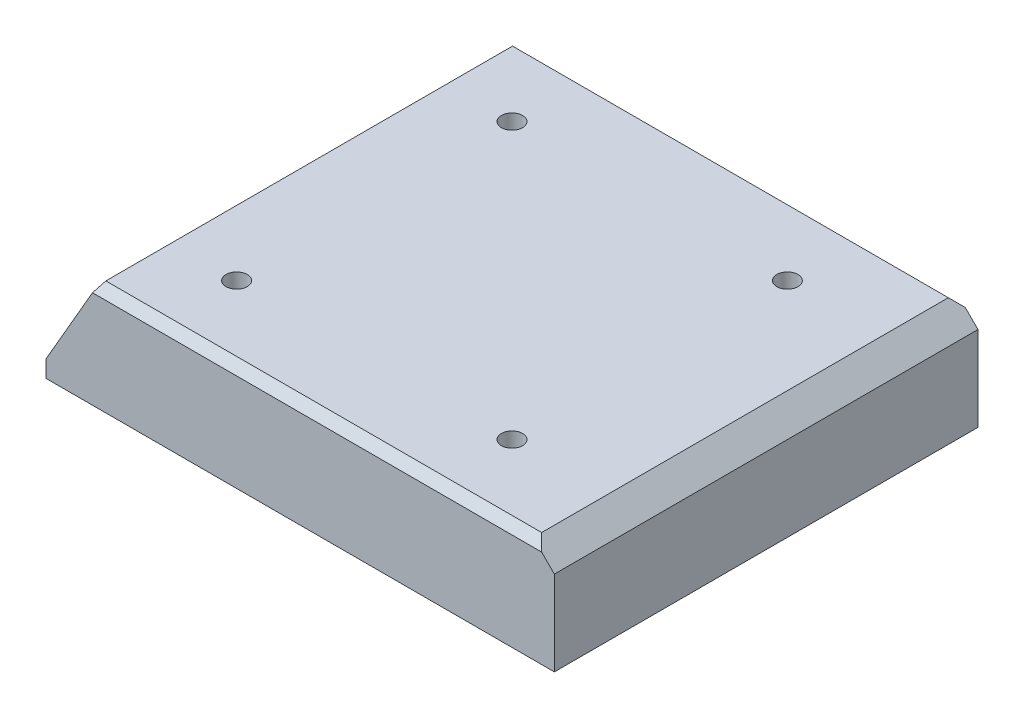
ISO-10303-21;
HEADER;
FILE_DESCRIPTION(('STEP AP214'),'2;1');
FILE_NAME('part.step','',(''),(''),'','','');
FILE_SCHEMA(('AUTOMOTIVE_DESIGN { 1 0 10303 214 1 1 1 1 }'));
ENDSEC;
DATA;
#1=APPLICATION_CONTEXT('core data for automotive mechanical design processes');
#2=APPLICATION_PROTOCOL_DEFINITION('international standard','automotive_design',2000,#1);
#3=PRODUCT_CONTEXT('',#1,'mechanical');
#4=PRODUCT('Part','Part','',(#3));
#5=PRODUCT_RELATED_PRODUCT_CATEGORY('part','',(#4));
#6=PRODUCT_DEFINITION_FORMATION('','',#4);
#7=PRODUCT_DEFINITION_CONTEXT('part definition',#1,'design');
#8=PRODUCT_DEFINITION('design','',#6,#7);
#9=PRODUCT_DEFINITION_SHAPE('','',#8);
#10=(LENGTH_UNIT() NAMED_UNIT(*) SI_UNIT(.MILLI.,.METRE.));
#11=(NAMED_UNIT(*) PLANE_ANGLE_UNIT() SI_UNIT($,.RADIAN.));
#12=(NAMED_UNIT(*) SI_UNIT($,.STERADIAN.) SOLID_ANGLE_UNIT());
#13=UNCERTAINTY_MEASURE_WITH_UNIT(LENGTH_MEASURE(1.E-05),#10,'distance_accuracy_value','');
#14=(GEOMETRIC_REPRESENTATION_CONTEXT(3) GLOBAL_UNCERTAINTY_ASSIGNED_CONTEXT((#13)) GLOBAL_UNIT_ASSIGNED_CONTEXT((#10,
#11,#12)) REPRESENTATION_CONTEXT('',''));
#15=CARTESIAN_POINT('',(0.,0.,0.));
#16=DIRECTION('',(0.,0.,1.));
#17=DIRECTION('',(1.,0.,0.));
#18=AXIS2_PLACEMENT_3D('',#15,#16,#17);
#19=CARTESIAN_POINT('',(55.,25.,50.));
#20=DIRECTION('',(0.,-1.,0.));
#21=DIRECTION('',(1.,0.,0.));
#22=AXIS2_PLACEMENT_3D('',#19,#20,#21);
#23=PLANE('',#22);
#24=CARTESIAN_POINT('',(-32.5,25.,32.5));
#25=DIRECTION('',(0.,-1.,0.));
#26=DIRECTION('',(1.,0.,0.));
#27=AXIS2_PLACEMENT_3D('',#24,#25,#26);
#28=CIRCLE('',#27,2.5);
#29=CARTESIAN_POINT('',(-30.,25.,32.5));
#30=VERTEX_POINT('',#29);
#31=EDGE_CURVE('E189',#30,#30,#28,.T.);
#32=ORIENTED_EDGE('',*,*,#31,.T.);
#33=EDGE_LOOP('',(#32));
#34=FACE_BOUND('',#33,.T.);
#35=DIRECTION('',(0.,0.,-1.));
#36=VECTOR('',#35,1.);
#37=CARTESIAN_POINT('',(55.,25.,50.));
#38=LINE('',#37,#36);
#39=CARTESIAN_POINT('',(55.,25.,48.));
#40=VERTEX_POINT('',#39);
#41=CARTESIAN_POINT('',(55.,25.,-48.));
#42=VERTEX_POINT('',#41);
#43=EDGE_CURVE('E133',#40,#42,#38,.T.);
#44=ORIENTED_EDGE('',*,*,#43,.T.);
#45=DIRECTION('',(-1.,0.,0.));
#46=VECTOR('',#45,1.);
#47=CARTESIAN_POINT('',(55.,25.,-48.));
#48=LINE('',#47,#46);
#49=CARTESIAN_POINT('',(-47.8756443470178,25.,-48.));
#50=VERTEX_POINT('',#49);
#51=EDGE_CURVE('E131',#42,#50,#48,.T.);
#52=ORIENTED_EDGE('',*,*,#51,.T.);
#53=DIRECTION('',(0.,0.,-1.));
#54=VECTOR('',#53,1.);
#55=CARTESIAN_POINT('',(-47.8756443470178,25.,50.));
#56=LINE('',#55,#54);
#57=CARTESIAN_POINT('',(-47.8756443470178,25.,48.));
#58=VERTEX_POINT('',#57);
#59=EDGE_CURVE('E136',#58,#50,#56,.T.);
#60=ORIENTED_EDGE('',*,*,#59,.F.);
#61=DIRECTION('',(1.,0.,0.));
#62=VECTOR('',#61,1.);
#63=CARTESIAN_POINT('',(55.,25.,48.));
#64=LINE('',#63,#62);
#65=EDGE_CURVE('E128',#58,#40,#64,.T.);
#66=ORIENTED_EDGE('',*,*,#65,.T.);
#67=EDGE_LOOP('',(#44,#52,#60,#66));
#68=FACE_BOUND('',#67,.T.);
#69=CARTESIAN_POINT('',(-32.5,25.,-32.5));
#70=DIRECTION('',(0.,1.,0.));
#71=DIRECTION('',(-1.,0.,0.));
#72=AXIS2_PLACEMENT_3D('',#69,#70,#71);
#73=CIRCLE('',#72,2.5);
#74=CARTESIAN_POINT('',(-35.,25.,-32.5));
#75=VERTEX_POINT('',#74);
#76=EDGE_CURVE('E192',#75,#75,#73,.T.);
#77=ORIENTED_EDGE('',*,*,#76,.F.);
#78=EDGE_LOOP('',(#77));
#79=FACE_BOUND('',#78,.T.);
#80=CARTESIAN_POINT('',(32.5,25.,-32.5));
#81=DIRECTION('',(0.,-1.,0.));
#82=DIRECTION('',(1.,0.,0.));
#83=AXIS2_PLACEMENT_3D('',#80,#81,#82);
#84=CIRCLE('',#83,2.5);
#85=CARTESIAN_POINT('',(30.,25.,-32.5));
#86=VERTEX_POINT('',#85);
#87=EDGE_CURVE('E197',#86,#86,#84,.T.);
#88=ORIENTED_EDGE('',*,*,#87,.T.);
#89=EDGE_LOOP('',(#88));
#90=FACE_BOUND('',#89,.T.);
#91=CARTESIAN_POINT('',(32.5,25.,32.5));
#92=DIRECTION('',(0.,1.,0.));
#93=DIRECTION('',(-1.,0.,0.));
#94=AXIS2_PLACEMENT_3D('',#91,#92,#93);
#95=CIRCLE('',#94,2.5);
#96=CARTESIAN_POINT('',(30.,25.,32.5));
#97=VERTEX_POINT('',#96);
#98=EDGE_CURVE('E208',#97,#97,#95,.T.);
#99=ORIENTED_EDGE('',*,*,#98,.F.);
#100=EDGE_LOOP('',(#99));
#101=FACE_BOUND('',#100,.T.);
#102=ADVANCED_FACE('F41',(#34,#68,#79,#90,#101),#23,.F.);
#103=CARTESIAN_POINT('',(-60.,0.,50.));
#104=DIRECTION('',(0.,1.,0.));
#105=DIRECTION('',(0.,0.,1.));
#106=AXIS2_PLACEMENT_3D('',#103,#104,#105);
#107=PLANE('',#106);
#108=CARTESIAN_POINT('',(-32.5,0.,32.5));
#109=DIRECTION('',(0.,-1.,0.));
#110=DIRECTION('',(1.,0.,0.));
#111=AXIS2_PLACEMENT_3D('',#108,#109,#110);
#112=CIRCLE('',#111,2.5);
#113=CARTESIAN_POINT('',(-30.,0.,32.5));
#114=VERTEX_POINT('',#113);
#115=EDGE_CURVE('E190',#114,#114,#112,.T.);
#116=ORIENTED_EDGE('',*,*,#115,.F.);
#117=EDGE_LOOP('',(#116));
#118=FACE_BOUND('',#117,.T.);
#119=DIRECTION('',(1.,0.,0.));
#120=VECTOR('',#119,1.);
#121=CARTESIAN_POINT('',(-60.,0.,-50.));
#122=LINE('',#121,#120);
#123=CARTESIAN_POINT('',(-60.,0.,-50.));
#124=VERTEX_POINT('',#123);
#125=CARTESIAN_POINT('',(60.,0.,-50.));
#126=VERTEX_POINT('',#125);
#127=EDGE_CURVE('E124',#124,#126,#122,.T.);
#128=ORIENTED_EDGE('',*,*,#127,.T.);
#129=DIRECTION('',(0.,0.,-1.));
#130=VECTOR('',#129,1.);
#131=CARTESIAN_POINT('',(60.,0.,50.));
#132=LINE('',#131,#130);
#133=CARTESIAN_POINT('',(60.,0.,50.));
#134=VERTEX_POINT('',#133);
#135=EDGE_CURVE('E175',#134,#126,#132,.T.);
#136=ORIENTED_EDGE('',*,*,#135,.F.);
#137=DIRECTION('',(1.,0.,0.));
#138=VECTOR('',#137,1.);
#139=CARTESIAN_POINT('',(-60.,0.,50.));
#140=LINE('',#139,#138);
#141=CARTESIAN_POINT('',(-60.,0.,50.));
#142=VERTEX_POINT('',#141);
#143=EDGE_CURVE('E121',#142,#134,#140,.T.);
#144=ORIENTED_EDGE('',*,*,#143,.F.);
#145=DIRECTION('',(0.,0.,-1.));
#146=VECTOR('',#145,1.);
#147=CARTESIAN_POINT('',(-60.,0.,50.));
#148=LINE('',#147,#146);
#149=EDGE_CURVE('E174',#142,#124,#148,.T.);
#150=ORIENTED_EDGE('',*,*,#149,.T.);
#151=EDGE_LOOP('',(#128,#136,#144,#150));
#152=FACE_BOUND('',#151,.T.);
#153=CARTESIAN_POINT('',(-32.5,0.,-32.5));
#154=DIRECTION('',(0.,1.,0.));
#155=DIRECTION('',(-1.,0.,0.));
#156=AXIS2_PLACEMENT_3D('',#153,#154,#155);
#157=CIRCLE('',#156,2.5);
#158=CARTESIAN_POINT('',(-35.,0.,-32.5));
#159=VERTEX_POINT('',#158);
#160=EDGE_CURVE('E205',#159,#159,#157,.T.);
#161=ORIENTED_EDGE('',*,*,#160,.T.);
#162=EDGE_LOOP('',(#161));
#163=FACE_BOUND('',#162,.T.);
#164=CARTESIAN_POINT('',(32.5,0.,-32.5));
#165=DIRECTION('',(0.,-1.,0.));
#166=DIRECTION('',(1.,0.,0.));
#167=AXIS2_PLACEMENT_3D('',#164,#165,#166);
#168=CIRCLE('',#167,2.5);
#169=CARTESIAN_POINT('',(30.,0.,-32.5));
#170=VERTEX_POINT('',#169);
#171=EDGE_CURVE('E213',#170,#170,#168,.T.);
#172=ORIENTED_EDGE('',*,*,#171,.F.);
#173=EDGE_LOOP('',(#172));
#174=FACE_BOUND('',#173,.T.);
#175=CARTESIAN_POINT('',(32.5,0.,32.5));
#176=DIRECTION('',(0.,1.,0.));
#177=DIRECTION('',(-1.,0.,0.));
#178=AXIS2_PLACEMENT_3D('',#175,#176,#177);
#179=CIRCLE('',#178,2.5);
#180=CARTESIAN_POINT('',(30.,0.,32.5));
#181=VERTEX_POINT('',#180);
#182=EDGE_CURVE('E204',#181,#181,#179,.T.);
#183=ORIENTED_EDGE('',*,*,#182,.T.);
#184=EDGE_LOOP('',(#183));
#185=FACE_BOUND('',#184,.T.);
#186=ADVANCED_FACE('F258',(#118,#152,#163,#174,#185),#107,.F.);
#187=CARTESIAN_POINT('',(60.,0.,50.));
#188=DIRECTION('',(-1.,0.,0.));
#189=DIRECTION('',(0.,0.,1.));
#190=AXIS2_PLACEMENT_3D('',#187,#188,#189);
#191=PLANE('',#190);
#192=DIRECTION('',(0.,1.,0.));
#193=VECTOR('',#192,1.);
#194=CARTESIAN_POINT('',(60.,0.,-50.));
#195=LINE('',#194,#193);
#196=CARTESIAN_POINT('',(60.,20.,-50.));
#197=VERTEX_POINT('',#196);
#198=EDGE_CURVE('E129',#126,#197,#195,.T.);
#199=ORIENTED_EDGE('',*,*,#198,.T.);
#200=DIRECTION('',(0.,0.,-1.));
#201=VECTOR('',#200,1.);
#202=CARTESIAN_POINT('',(60.,20.,50.));
#203=LINE('',#202,#201);
#204=CARTESIAN_POINT('',(60.,20.,50.));
#205=VERTEX_POINT('',#204);
#206=EDGE_CURVE('E112',#205,#197,#203,.T.);
#207=ORIENTED_EDGE('',*,*,#206,.F.);
#208=DIRECTION('',(0.,1.,0.));
#209=VECTOR('',#208,1.);
#210=CARTESIAN_POINT('',(60.,0.,50.));
#211=LINE('',#210,#209);
#212=EDGE_CURVE('E118',#134,#205,#211,.T.);
#213=ORIENTED_EDGE('',*,*,#212,.F.);
#214=ORIENTED_EDGE('',*,*,#135,.T.);
#215=EDGE_LOOP('',(#199,#207,#213,#214));
#216=FACE_BOUND('',#215,.T.);
#217=ADVANCED_FACE('F130',(#216),#191,.F.);
#218=CARTESIAN_POINT('',(60.,20.,50.));
#219=DIRECTION('',(-0.707106781186546,-0.707106781186549,0.));
#220=DIRECTION('',(0.707106781186549,-0.707106781186546,0.));
#221=AXIS2_PLACEMENT_3D('',#218,#219,#220);
#222=PLANE('',#221);
#223=DIRECTION('',(-0.707106781186549,0.707106781186546,0.));
#224=VECTOR('',#223,1.);
#225=CARTESIAN_POINT('',(60.,20.,-50.));
#226=LINE('',#225,#224);
#227=CARTESIAN_POINT('',(57.,23.,-50.));
#228=VERTEX_POINT('',#227);
#229=EDGE_CURVE('E146',#197,#228,#226,.T.);
#230=ORIENTED_EDGE('',*,*,#229,.T.);
#231=DIRECTION('',(0.577350269189628,-0.577350269189625,-0.577350269189625));
#232=VECTOR('',#231,1.);
#233=CARTESIAN_POINT('',(55.,25.,-48.));
#234=LINE('',#233,#232);
#235=EDGE_CURVE('E49',#228,#42,#234,.F.);
#236=ORIENTED_EDGE('',*,*,#235,.T.);
#237=ORIENTED_EDGE('',*,*,#43,.F.);
#238=DIRECTION('',(0.577350269189628,-0.577350269189625,0.577350269189625));
#239=VECTOR('',#238,1.);
#240=CARTESIAN_POINT('',(37.9999999999999,42.,31.));
#241=LINE('',#240,#239);
#242=CARTESIAN_POINT('',(57.,23.,50.));
#243=VERTEX_POINT('',#242);
#244=EDGE_CURVE('E60',#40,#243,#241,.T.);
#245=ORIENTED_EDGE('',*,*,#244,.T.);
#246=DIRECTION('',(-0.707106781186549,0.707106781186546,0.));
#247=VECTOR('',#246,1.);
#248=CARTESIAN_POINT('',(60.,20.,50.));
#249=LINE('',#248,#247);
#250=EDGE_CURVE('E110',#205,#243,#249,.T.);
#251=ORIENTED_EDGE('',*,*,#250,.F.);
#252=ORIENTED_EDGE('',*,*,#206,.T.);
#253=EDGE_LOOP('',(#230,#236,#237,#245,#251,#252));
#254=FACE_BOUND('',#253,.T.);
#255=ADVANCED_FACE('F108',(#254),#222,.F.);
#256=CARTESIAN_POINT('',(-47.8756443470178,25.,50.));
#257=DIRECTION('',(0.866025403784438,-0.500000000000001,0.));
#258=DIRECTION('',(0.500000000000001,0.866025403784438,0.));
#259=AXIS2_PLACEMENT_3D('',#256,#257,#258);
#260=PLANE('',#259);
#261=CARTESIAN_POINT('',(-53.9378221735089,14.5,-25.));
#262=DIRECTION('',(-0.866025403784438,0.500000000000001,0.));
#263=DIRECTION('',(-0.500000000000001,-0.866025403784438,0.));
#264=AXIS2_PLACEMENT_3D('',#261,#262,#263);
#265=CIRCLE('',#264,1.5);
#266=CARTESIAN_POINT('',(-54.6878221735089,13.2009618943233,-25.));
#267=VERTEX_POINT('',#266);
#268=EDGE_CURVE('E228',#267,#267,#265,.T.);
#269=ORIENTED_EDGE('',*,*,#268,.F.);
#270=EDGE_LOOP('',(#269));
#271=FACE_BOUND('',#270,.T.);
#272=CARTESIAN_POINT('',(-53.9378221735089,14.5,27.));
#273=DIRECTION('',(-0.866025403784438,0.500000000000001,0.));
#274=DIRECTION('',(-0.500000000000001,-0.866025403784438,0.));
#275=AXIS2_PLACEMENT_3D('',#272,#273,#274);
#276=CIRCLE('',#275,1.5);
#277=CARTESIAN_POINT('',(-54.6878221735089,13.2009618943233,27.));
#278=VERTEX_POINT('',#277);
#279=EDGE_CURVE('E231',#278,#278,#276,.T.);
#280=ORIENTED_EDGE('',*,*,#279,.F.);
#281=EDGE_LOOP('',(#280));
#282=FACE_BOUND('',#281,.T.);
#283=ORIENTED_EDGE('',*,*,#59,.T.);
#284=DIRECTION('',(0.377964473009228,0.654653670707977,0.654653670707977));
#285=VECTOR('',#284,1.);
#286=CARTESIAN_POINT('',(-33.1791237260152,50.4551204100601,-22.5448795899398));
#287=LINE('',#286,#285);
#288=CARTESIAN_POINT('',(-49.0303448853971,23.,-50.));
#289=VERTEX_POINT('',#288);
#290=EDGE_CURVE('E145',#50,#289,#287,.F.);
#291=ORIENTED_EDGE('',*,*,#290,.T.);
#292=DIRECTION('',(-0.500000000000001,-0.866025403784438,0.));
#293=VECTOR('',#292,1.);
#294=CARTESIAN_POINT('',(-47.8756443470178,25.,-50.));
#295=LINE('',#294,#293);
#296=CARTESIAN_POINT('',(-60.,4.,-50.));
#297=VERTEX_POINT('',#296);
#298=EDGE_CURVE('E159',#289,#297,#295,.T.);
#299=ORIENTED_EDGE('',*,*,#298,.T.);
#300=DIRECTION('',(0.,0.,-1.));
#301=VECTOR('',#300,1.);
#302=CARTESIAN_POINT('',(-60.,4.,50.));
#303=LINE('',#302,#301);
#304=CARTESIAN_POINT('',(-60.,4.,50.));
#305=VERTEX_POINT('',#304);
#306=EDGE_CURVE('E180',#305,#297,#303,.T.);
#307=ORIENTED_EDGE('',*,*,#306,.F.);
#308=DIRECTION('',(-0.500000000000001,-0.866025403784438,0.));
#309=VECTOR('',#308,1.);
#310=CARTESIAN_POINT('',(-47.8756443470178,25.,50.));
#311=LINE('',#310,#309);
#312=CARTESIAN_POINT('',(-49.0303448853971,23.,50.));
#313=VERTEX_POINT('',#312);
#314=EDGE_CURVE('E113',#313,#305,#311,.T.);
#315=ORIENTED_EDGE('',*,*,#314,.F.);
#316=DIRECTION('',(0.377964473009228,0.654653670707977,-0.654653670707977));
#317=VECTOR('',#316,1.);
#318=CARTESIAN_POINT('',(-42.0260099017689,35.1318640648761,37.8681359351239));
#319=LINE('',#318,#317);
#320=EDGE_CURVE('E142',#313,#58,#319,.T.);
#321=ORIENTED_EDGE('',*,*,#320,.T.);
#322=EDGE_LOOP('',(#283,#291,#299,#307,#315,#321));
#323=FACE_BOUND('',#322,.T.);
#324=ADVANCED_FACE('F158',(#271,#282,#323),#260,.F.);
#325=CARTESIAN_POINT('',(-60.,4.,50.));
#326=DIRECTION('',(1.,0.,0.));
#327=DIRECTION('',(0.,0.,-1.));
#328=AXIS2_PLACEMENT_3D('',#325,#326,#327);
#329=PLANE('',#328);
#330=DIRECTION('',(0.,-1.,0.));
#331=VECTOR('',#330,1.);
#332=CARTESIAN_POINT('',(-60.,4.,-50.));
#333=LINE('',#332,#331);
#334=EDGE_CURVE('E164',#297,#124,#333,.T.);
#335=ORIENTED_EDGE('',*,*,#334,.T.);
#336=ORIENTED_EDGE('',*,*,#149,.F.);
#337=DIRECTION('',(0.,-1.,0.));
#338=VECTOR('',#337,1.);
#339=CARTESIAN_POINT('',(-60.,4.,50.));
#340=LINE('',#339,#338);
#341=EDGE_CURVE('E185',#305,#142,#340,.T.);
#342=ORIENTED_EDGE('',*,*,#341,.F.);
#343=ORIENTED_EDGE('',*,*,#306,.T.);
#344=EDGE_LOOP('',(#335,#336,#342,#343));
#345=FACE_BOUND('',#344,.T.);
#346=ADVANCED_FACE('F179',(#345),#329,.F.);
#347=CARTESIAN_POINT('',(0.,0.,50.));
#348=DIRECTION('',(0.,0.,1.));
#349=DIRECTION('',(1.,0.,0.));
#350=AXIS2_PLACEMENT_3D('',#347,#348,#349);
#351=PLANE('',#350);
#352=ORIENTED_EDGE('',*,*,#250,.T.);
#353=DIRECTION('',(-1.,0.,0.));
#354=VECTOR('',#353,1.);
#355=CARTESIAN_POINT('',(-47.8756443470178,23.,50.));
#356=LINE('',#355,#354);
#357=EDGE_CURVE('E11',#243,#313,#356,.T.);
#358=ORIENTED_EDGE('',*,*,#357,.T.);
#359=ORIENTED_EDGE('',*,*,#314,.T.);
#360=ORIENTED_EDGE('',*,*,#341,.T.);
#361=ORIENTED_EDGE('',*,*,#143,.T.);
#362=ORIENTED_EDGE('',*,*,#212,.T.);
#363=EDGE_LOOP('',(#352,#358,#359,#360,#361,#362));
#364=FACE_BOUND('',#363,.T.);
#365=ADVANCED_FACE('F119',(#364),#351,.T.);
#366=CARTESIAN_POINT('',(0.,0.,-50.));
#367=DIRECTION('',(0.,0.,1.));
#368=DIRECTION('',(1.,0.,0.));
#369=AXIS2_PLACEMENT_3D('',#366,#367,#368);
#370=PLANE('',#369);
#371=ORIENTED_EDGE('',*,*,#298,.F.);
#372=DIRECTION('',(1.,0.,0.));
#373=VECTOR('',#372,1.);
#374=CARTESIAN_POINT('',(0.,23.,-50.));
#375=LINE('',#374,#373);
#376=EDGE_CURVE('E62',#289,#228,#375,.T.);
#377=ORIENTED_EDGE('',*,*,#376,.T.);
#378=ORIENTED_EDGE('',*,*,#229,.F.);
#379=ORIENTED_EDGE('',*,*,#198,.F.);
#380=ORIENTED_EDGE('',*,*,#127,.F.);
#381=ORIENTED_EDGE('',*,*,#334,.F.);
#382=EDGE_LOOP('',(#371,#377,#378,#379,#380,#381));
#383=FACE_BOUND('',#382,.T.);
#384=ADVANCED_FACE('F162',(#383),#370,.F.);
#385=CARTESIAN_POINT('',(-32.5,0.,-32.5));
#386=DIRECTION('',(0.,1.,0.));
#387=DIRECTION('',(-1.,0.,0.));
#388=AXIS2_PLACEMENT_3D('',#385,#386,#387);
#389=CYLINDRICAL_SURFACE('',#388,2.5);
#390=ORIENTED_EDGE('',*,*,#160,.F.);
#391=EDGE_LOOP('',(#390));
#392=FACE_BOUND('',#391,.T.);
#393=ORIENTED_EDGE('',*,*,#76,.T.);
#394=EDGE_LOOP('',(#393));
#395=FACE_BOUND('',#394,.T.);
#396=ADVANCED_FACE('F305',(#392,#395),#389,.F.);
#397=CARTESIAN_POINT('',(-32.5,0.,32.5));
#398=DIRECTION('',(0.,1.,0.));
#399=DIRECTION('',(-1.,0.,0.));
#400=AXIS2_PLACEMENT_3D('',#397,#398,#399);
#401=CYLINDRICAL_SURFACE('',#400,2.5);
#402=ORIENTED_EDGE('',*,*,#115,.T.);
#403=EDGE_LOOP('',(#402));
#404=FACE_BOUND('',#403,.T.);
#405=ORIENTED_EDGE('',*,*,#31,.F.);
#406=EDGE_LOOP('',(#405));
#407=FACE_BOUND('',#406,.T.);
#408=ADVANCED_FACE('F304',(#404,#407),#401,.F.);
#409=CARTESIAN_POINT('',(32.5,0.,-32.5));
#410=DIRECTION('',(0.,1.,0.));
#411=DIRECTION('',(-1.,0.,0.));
#412=AXIS2_PLACEMENT_3D('',#409,#410,#411);
#413=CYLINDRICAL_SURFACE('',#412,2.5);
#414=CARTESIAN_POINT('',(30.,0.,-32.5));
#415=CARTESIAN_POINT('',(30.,0.260416666666646,-32.5));
#416=CARTESIAN_POINT('',(30.,0.520833333333313,-32.5));
#417=CARTESIAN_POINT('',(30.,1.04166666666665,-32.5));
#418=CARTESIAN_POINT('',(30.,1.30208333333331,-32.5));
#419=CARTESIAN_POINT('',(30.,1.82291666666665,-32.5));
#420=CARTESIAN_POINT('',(30.,2.08333333333331,-32.5));
#421=CARTESIAN_POINT('',(30.,2.60416666666665,-32.5));
#422=CARTESIAN_POINT('',(30.,2.86458333333331,-32.5));
#423=CARTESIAN_POINT('',(30.,3.38541666666665,-32.5));
#424=CARTESIAN_POINT('',(30.,3.64583333333331,-32.5));
#425=CARTESIAN_POINT('',(30.,4.16666666666665,-32.5));
#426=CARTESIAN_POINT('',(30.,4.42708333333331,-32.5));
#427=CARTESIAN_POINT('',(30.,4.94791666666665,-32.5));
#428=CARTESIAN_POINT('',(30.,5.20833333333331,-32.5));
#429=CARTESIAN_POINT('',(30.,5.72916666666665,-32.5));
#430=CARTESIAN_POINT('',(30.,5.98958333333332,-32.5));
#431=CARTESIAN_POINT('',(30.,6.51041666666665,-32.5));
#432=CARTESIAN_POINT('',(30.,6.77083333333332,-32.5));
#433=CARTESIAN_POINT('',(30.,7.29166666666665,-32.5));
#434=CARTESIAN_POINT('',(30.,7.55208333333332,-32.5));
#435=CARTESIAN_POINT('',(30.,8.07291666666665,-32.5));
#436=CARTESIAN_POINT('',(30.,8.33333333333332,-32.5));
#437=CARTESIAN_POINT('',(30.,8.85416666666665,-32.5));
#438=CARTESIAN_POINT('',(30.,9.11458333333332,-32.5));
#439=CARTESIAN_POINT('',(30.,9.63541666666665,-32.5));
#440=CARTESIAN_POINT('',(30.,9.89583333333332,-32.5));
#441=CARTESIAN_POINT('',(30.,10.4166666666667,-32.5));
#442=CARTESIAN_POINT('',(30.,10.6770833333333,-32.5));
#443=CARTESIAN_POINT('',(30.,11.1979166666667,-32.5));
#444=CARTESIAN_POINT('',(30.,11.4583333333333,-32.5));
#445=CARTESIAN_POINT('',(30.,11.9791666666667,-32.5));
#446=CARTESIAN_POINT('',(30.,12.2395833333333,-32.5));
#447=CARTESIAN_POINT('',(30.,12.7604166666667,-32.5));
#448=CARTESIAN_POINT('',(30.,13.0208333333333,-32.5));
#449=CARTESIAN_POINT('',(30.,13.5416666666667,-32.5));
#450=CARTESIAN_POINT('',(30.,13.8020833333333,-32.5));
#451=CARTESIAN_POINT('',(30.,14.3229166666667,-32.5));
#452=CARTESIAN_POINT('',(30.,14.5833333333333,-32.5));
#453=CARTESIAN_POINT('',(30.,15.1041666666667,-32.5));
#454=CARTESIAN_POINT('',(30.,15.3645833333333,-32.5));
#455=CARTESIAN_POINT('',(30.,15.8854166666667,-32.5));
#456=CARTESIAN_POINT('',(30.,16.1458333333333,-32.5));
#457=CARTESIAN_POINT('',(30.,16.6666666666667,-32.5));
#458=CARTESIAN_POINT('',(30.,16.9270833333333,-32.5));
#459=CARTESIAN_POINT('',(30.,17.4479166666667,-32.5));
#460=CARTESIAN_POINT('',(30.,17.7083333333333,-32.5));
#461=CARTESIAN_POINT('',(30.,18.2291666666667,-32.5));
#462=CARTESIAN_POINT('',(30.,18.4895833333333,-32.5));
#463=CARTESIAN_POINT('',(30.,19.0104166666667,-32.5));
#464=CARTESIAN_POINT('',(30.,19.2708333333333,-32.5));
#465=CARTESIAN_POINT('',(30.,19.7916666666667,-32.5));
#466=CARTESIAN_POINT('',(30.,20.0520833333333,-32.5));
#467=CARTESIAN_POINT('',(30.,20.5729166666667,-32.5));
#468=CARTESIAN_POINT('',(30.,20.8333333333333,-32.5));
#469=CARTESIAN_POINT('',(30.,21.3541666666667,-32.5));
#470=CARTESIAN_POINT('',(30.,21.6145833333333,-32.5));
#471=CARTESIAN_POINT('',(30.,22.1354166666667,-32.5));
#472=CARTESIAN_POINT('',(30.,22.3958333333333,-32.5));
#473=CARTESIAN_POINT('',(30.,22.9166666666667,-32.5));
#474=CARTESIAN_POINT('',(30.,23.1770833333333,-32.5));
#475=CARTESIAN_POINT('',(30.,23.6979166666667,-32.5));
#476=CARTESIAN_POINT('',(30.,23.9583333333333,-32.5));
#477=CARTESIAN_POINT('',(30.,24.4791666666667,-32.5));
#478=CARTESIAN_POINT('',(30.,24.7395833333333,-32.5));
#479=CARTESIAN_POINT('',(30.,25.,-32.5));
#480=B_SPLINE_CURVE_WITH_KNOTS('',3,(#414,#415,#416,#417,#418,#419,#420,#421,#422,#423,#424,
#425,#426,#427,#428,#429,#430,#431,#432,#433,#434,#435,#436,#437,#438,#439,#440,#441,#442,#443,
#444,#445,#446,#447,#448,#449,#450,#451,#452,#453,#454,#455,#456,#457,#458,#459,#460,#461,#462,
#463,#464,#465,#466,#467,#468,#469,#470,#471,#472,#473,#474,#475,#476,#477,#478,#479),
.UNSPECIFIED.,.F.,.F.,(4,2,2,2,2,2,2,2,2,2,2,2,2,2,2,2,2,2,2,2,2,2,2,2,2,2,2,2,2,2,2,2,4),(0.,
0.78125,1.5625,2.34375,3.125,3.90625,4.6875,5.46875,6.25,7.03125,7.8125,8.59375,9.375,10.15625,
10.9375,11.71875,12.5,13.28125,14.0625,14.84375,15.625,16.40625,17.1875,17.96875,18.75,19.53125,
20.3125,21.09375,21.875,22.65625,23.4375,24.21875,25.),.UNSPECIFIED.);
#481=EDGE_CURVE('BSEAM253',#170,#86,#480,.T.);
#482=ORIENTED_EDGE('',*,*,#171,.T.);
#483=ORIENTED_EDGE('',*,*,#87,.F.);
#484=ORIENTED_EDGE('',*,*,#481,.T.);
#485=ORIENTED_EDGE('',*,*,#481,.F.);
#486=EDGE_LOOP('',(#482,#484,#483,#485));
#487=FACE_BOUND('',#486,.T.);
#488=ADVANCED_FACE('F253',(#487),#413,.F.);
#489=CARTESIAN_POINT('',(32.5,0.,32.5));
#490=DIRECTION('',(0.,1.,0.));
#491=DIRECTION('',(-1.,0.,0.));
#492=AXIS2_PLACEMENT_3D('',#489,#490,#491);
#493=CYLINDRICAL_SURFACE('',#492,2.5);
#494=CARTESIAN_POINT('',(30.,0.,32.5));
#495=CARTESIAN_POINT('',(30.,0.260416666666646,32.5));
#496=CARTESIAN_POINT('',(30.,0.520833333333313,32.5));
#497=CARTESIAN_POINT('',(30.,1.04166666666665,32.5));
#498=CARTESIAN_POINT('',(30.,1.30208333333331,32.5));
#499=CARTESIAN_POINT('',(30.,1.82291666666665,32.5));
#500=CARTESIAN_POINT('',(30.,2.08333333333331,32.5));
#501=CARTESIAN_POINT('',(30.,2.60416666666665,32.5));
#502=CARTESIAN_POINT('',(30.,2.86458333333331,32.5));
#503=CARTESIAN_POINT('',(30.,3.38541666666665,32.5));
#504=CARTESIAN_POINT('',(30.,3.64583333333331,32.5));
#505=CARTESIAN_POINT('',(30.,4.16666666666665,32.5));
#506=CARTESIAN_POINT('',(30.,4.42708333333331,32.5));
#507=CARTESIAN_POINT('',(30.,4.94791666666665,32.5));
#508=CARTESIAN_POINT('',(30.,5.20833333333331,32.5));
#509=CARTESIAN_POINT('',(30.,5.72916666666665,32.5));
#510=CARTESIAN_POINT('',(30.,5.98958333333332,32.5));
#511=CARTESIAN_POINT('',(30.,6.51041666666665,32.5));
#512=CARTESIAN_POINT('',(30.,6.77083333333332,32.5));
#513=CARTESIAN_POINT('',(30.,7.29166666666665,32.5));
#514=CARTESIAN_POINT('',(30.,7.55208333333332,32.5));
#515=CARTESIAN_POINT('',(30.,8.07291666666665,32.5));
#516=CARTESIAN_POINT('',(30.,8.33333333333332,32.5));
#517=CARTESIAN_POINT('',(30.,8.85416666666665,32.5));
#518=CARTESIAN_POINT('',(30.,9.11458333333332,32.5));
#519=CARTESIAN_POINT('',(30.,9.63541666666665,32.5));
#520=CARTESIAN_POINT('',(30.,9.89583333333332,32.5));
#521=CARTESIAN_POINT('',(30.,10.4166666666667,32.5));
#522=CARTESIAN_POINT('',(30.,10.6770833333333,32.5));
#523=CARTESIAN_POINT('',(30.,11.1979166666667,32.5));
#524=CARTESIAN_POINT('',(30.,11.4583333333333,32.5));
#525=CARTESIAN_POINT('',(30.,11.9791666666667,32.5));
#526=CARTESIAN_POINT('',(30.,12.2395833333333,32.5));
#527=CARTESIAN_POINT('',(30.,12.7604166666667,32.5));
#528=CARTESIAN_POINT('',(30.,13.0208333333333,32.5));
#529=CARTESIAN_POINT('',(30.,13.5416666666667,32.5));
#530=CARTESIAN_POINT('',(30.,13.8020833333333,32.5));
#531=CARTESIAN_POINT('',(30.,14.3229166666667,32.5));
#532=CARTESIAN_POINT('',(30.,14.5833333333333,32.5));
#533=CARTESIAN_POINT('',(30.,15.1041666666667,32.5));
#534=CARTESIAN_POINT('',(30.,15.3645833333333,32.5));
#535=CARTESIAN_POINT('',(30.,15.8854166666667,32.5));
#536=CARTESIAN_POINT('',(30.,16.1458333333333,32.5));
#537=CARTESIAN_POINT('',(30.,16.6666666666667,32.5));
#538=CARTESIAN_POINT('',(30.,16.9270833333333,32.5));
#539=CARTESIAN_POINT('',(30.,17.4479166666667,32.5));
#540=CARTESIAN_POINT('',(30.,17.7083333333333,32.5));
#541=CARTESIAN_POINT('',(30.,18.2291666666667,32.5));
#542=CARTESIAN_POINT('',(30.,18.4895833333333,32.5));
#543=CARTESIAN_POINT('',(30.,19.0104166666667,32.5));
#544=CARTESIAN_POINT('',(30.,19.2708333333333,32.5));
#545=CARTESIAN_POINT('',(30.,19.7916666666667,32.5));
#546=CARTESIAN_POINT('',(30.,20.0520833333333,32.5));
#547=CARTESIAN_POINT('',(30.,20.5729166666667,32.5));
#548=CARTESIAN_POINT('',(30.,20.8333333333333,32.5));
#549=CARTESIAN_POINT('',(30.,21.3541666666667,32.5));
#550=CARTESIAN_POINT('',(30.,21.6145833333333,32.5));
#551=CARTESIAN_POINT('',(30.,22.1354166666667,32.5));
#552=CARTESIAN_POINT('',(30.,22.3958333333333,32.5));
#553=CARTESIAN_POINT('',(30.,22.9166666666667,32.5));
#554=CARTESIAN_POINT('',(30.,23.1770833333333,32.5));
#555=CARTESIAN_POINT('',(30.,23.6979166666667,32.5));
#556=CARTESIAN_POINT('',(30.,23.9583333333333,32.5));
#557=CARTESIAN_POINT('',(30.,24.4791666666667,32.5));
#558=CARTESIAN_POINT('',(30.,24.7395833333333,32.5));
#559=CARTESIAN_POINT('',(30.,25.,32.5));
#560=B_SPLINE_CURVE_WITH_KNOTS('',3,(#494,#495,#496,#497,#498,#499,#500,#501,#502,#503,#504,
#505,#506,#507,#508,#509,#510,#511,#512,#513,#514,#515,#516,#517,#518,#519,#520,#521,#522,#523,
#524,#525,#526,#527,#528,#529,#530,#531,#532,#533,#534,#535,#536,#537,#538,#539,#540,#541,#542,
#543,#544,#545,#546,#547,#548,#549,#550,#551,#552,#553,#554,#555,#556,#557,#558,#559),
.UNSPECIFIED.,.F.,.F.,(4,2,2,2,2,2,2,2,2,2,2,2,2,2,2,2,2,2,2,2,2,2,2,2,2,2,2,2,2,2,2,2,4),(0.,
0.78125,1.5625,2.34375,3.125,3.90625,4.6875,5.46875,6.25,7.03125,7.8125,8.59375,9.375,10.15625,
10.9375,11.71875,12.5,13.28125,14.0625,14.84375,15.625,16.40625,17.1875,17.96875,18.75,19.53125,
20.3125,21.09375,21.875,22.65625,23.4375,24.21875,25.),.UNSPECIFIED.);
#561=EDGE_CURVE('BSEAM241',#181,#97,#560,.T.);
#562=ORIENTED_EDGE('',*,*,#182,.F.);
#563=ORIENTED_EDGE('',*,*,#98,.T.);
#564=ORIENTED_EDGE('',*,*,#561,.T.);
#565=ORIENTED_EDGE('',*,*,#561,.F.);
#566=EDGE_LOOP('',(#562,#564,#563,#565));
#567=FACE_BOUND('',#566,.T.);
#568=ADVANCED_FACE('F241',(#567),#493,.F.);
#569=CARTESIAN_POINT('',(-43.1991071665819,8.29999999999999,27.));
#570=DIRECTION('',(-0.866025403784438,0.500000000000001,0.));
#571=DIRECTION('',(-0.500000000000001,-0.866025403784438,0.));
#572=AXIS2_PLACEMENT_3D('',#569,#570,#571);
#573=CYLINDRICAL_SURFACE('',#572,1.5);
#574=CARTESIAN_POINT('',(-43.1991071665819,8.29999999999999,27.));
#575=DIRECTION('',(-0.866025403784438,0.500000000000001,0.));
#576=DIRECTION('',(-0.500000000000001,-0.866025403784438,0.));
#577=AXIS2_PLACEMENT_3D('',#574,#575,#576);
#578=CIRCLE('',#577,1.5);
#579=CARTESIAN_POINT('',(-43.9491071665819,7.00096189432333,27.));
#580=VERTEX_POINT('',#579);
#581=EDGE_CURVE('E216',#580,#580,#578,.T.);
#582=ORIENTED_EDGE('',*,*,#581,.F.);
#583=EDGE_LOOP('',(#582));
#584=FACE_BOUND('',#583,.T.);
#585=ORIENTED_EDGE('',*,*,#279,.T.);
#586=EDGE_LOOP('',(#585));
#587=FACE_BOUND('',#586,.T.);
#588=ADVANCED_FACE('F243',(#584,#587),#573,.F.);
#589=CARTESIAN_POINT('',(-43.1991071665819,8.29999999999999,27.));
#590=DIRECTION('',(-0.866025403784438,0.500000000000001,0.));
#591=DIRECTION('',(-0.500000000000001,-0.866025403784438,0.));
#592=AXIS2_PLACEMENT_3D('',#589,#590,#591);
#593=PLANE('',#592);
#594=ORIENTED_EDGE('',*,*,#581,.T.);
#595=EDGE_LOOP('',(#594));
#596=FACE_BOUND('',#595,.T.);
#597=ADVANCED_FACE('F239',(#596),#593,.T.);
#598=CARTESIAN_POINT('',(-43.1991071665819,8.29999999999998,-25.));
#599=DIRECTION('',(-0.866025403784438,0.500000000000001,0.));
#600=DIRECTION('',(-0.500000000000001,-0.866025403784438,0.));
#601=AXIS2_PLACEMENT_3D('',#598,#599,#600);
#602=CYLINDRICAL_SURFACE('',#601,1.5);
#603=CARTESIAN_POINT('',(-43.1991071665819,8.29999999999998,-25.));
#604=DIRECTION('',(-0.866025403784438,0.500000000000001,0.));
#605=DIRECTION('',(-0.500000000000001,-0.866025403784438,0.));
#606=AXIS2_PLACEMENT_3D('',#603,#604,#605);
#607=CIRCLE('',#606,1.5);
#608=CARTESIAN_POINT('',(-43.9491071665819,7.00096189432332,-25.));
#609=VERTEX_POINT('',#608);
#610=EDGE_CURVE('E225',#609,#609,#607,.T.);
#611=ORIENTED_EDGE('',*,*,#610,.F.);
#612=EDGE_LOOP('',(#611));
#613=FACE_BOUND('',#612,.T.);
#614=ORIENTED_EDGE('',*,*,#268,.T.);
#615=EDGE_LOOP('',(#614));
#616=FACE_BOUND('',#615,.T.);
#617=ADVANCED_FACE('F247',(#613,#616),#602,.F.);
#618=CARTESIAN_POINT('',(-43.1991071665819,8.29999999999998,-25.));
#619=DIRECTION('',(-0.866025403784438,0.500000000000001,0.));
#620=DIRECTION('',(-0.500000000000001,-0.866025403784438,0.));
#621=AXIS2_PLACEMENT_3D('',#618,#619,#620);
#622=PLANE('',#621);
#623=ORIENTED_EDGE('',*,*,#610,.T.);
#624=EDGE_LOOP('',(#623));
#625=FACE_BOUND('',#624,.T.);
#626=ADVANCED_FACE('F274',(#625),#622,.T.);
#627=CARTESIAN_POINT('',(55.,25.,-48.));
#628=DIRECTION('',(0.,-0.707106781186548,0.707106781186547));
#629=DIRECTION('',(-1.,0.,0.));
#630=AXIS2_PLACEMENT_3D('',#627,#628,#629);
#631=PLANE('',#630);
#632=ORIENTED_EDGE('',*,*,#235,.F.);
#633=ORIENTED_EDGE('',*,*,#376,.F.);
#634=ORIENTED_EDGE('',*,*,#290,.F.);
#635=ORIENTED_EDGE('',*,*,#51,.F.);
#636=EDGE_LOOP('',(#632,#633,#634,#635));
#637=FACE_BOUND('',#636,.T.);
#638=ADVANCED_FACE('F156',(#637),#631,.F.);
#639=CARTESIAN_POINT('',(0.,23.,50.));
#640=DIRECTION('',(0.,0.707106781186548,0.707106781186547));
#641=DIRECTION('',(1.,0.,0.));
#642=AXIS2_PLACEMENT_3D('',#639,#640,#641);
#643=PLANE('',#642);
#644=ORIENTED_EDGE('',*,*,#244,.F.);
#645=ORIENTED_EDGE('',*,*,#65,.F.);
#646=ORIENTED_EDGE('',*,*,#320,.F.);
#647=ORIENTED_EDGE('',*,*,#357,.F.);
#648=EDGE_LOOP('',(#644,#645,#646,#647));
#649=FACE_BOUND('',#648,.T.);
#650=ADVANCED_FACE('F42',(#649),#643,.T.);
#651=CLOSED_SHELL('',(#102,#186,#217,#255,#324,#346,#365,#384,#396,#408,#488,#568,#588,#597,
#617,#626,#638,#650));
#652=MANIFOLD_SOLID_BREP('B2',#651);
#653=ADVANCED_BREP_SHAPE_REPRESENTATION('',(#18,#652),#14);
#654=SHAPE_DEFINITION_REPRESENTATION(#9,#653);
ENDSEC;
END-ISO-10303-21;
